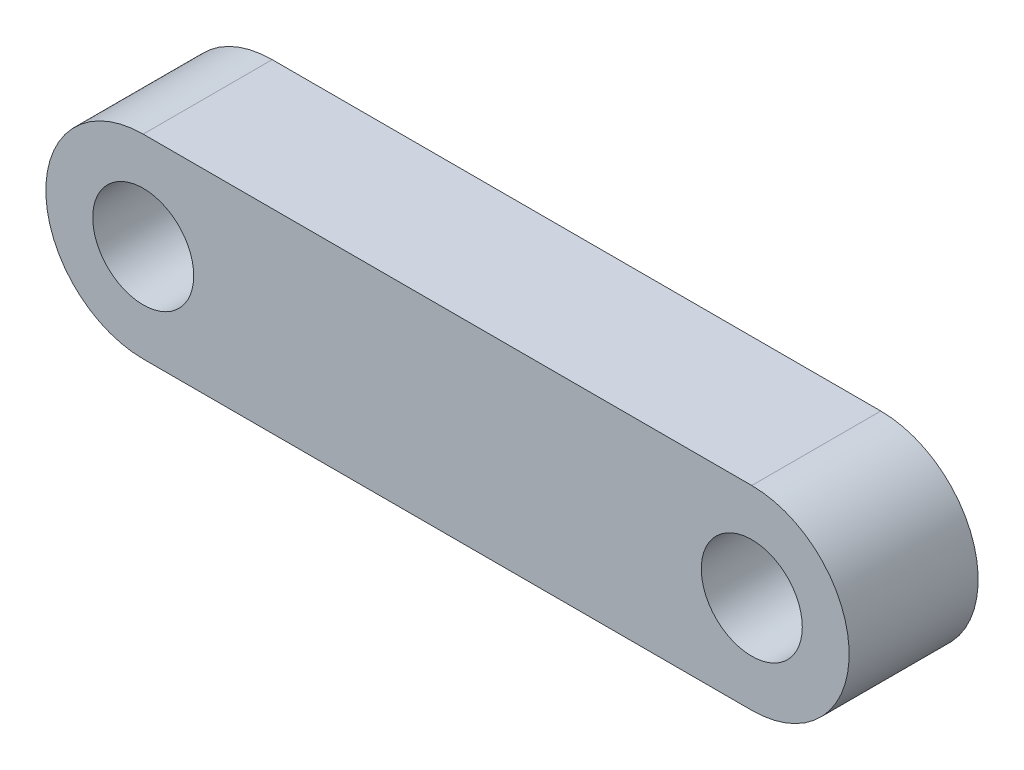
ISO-10303-21;
HEADER;
FILE_DESCRIPTION(('STEP AP214'),'2;1');
FILE_NAME('part.step','',(''),(''),'','','');
FILE_SCHEMA(('AUTOMOTIVE_DESIGN { 1 0 10303 214 1 1 1 1 }'));
ENDSEC;
DATA;
#1=APPLICATION_CONTEXT('core data for automotive mechanical design processes');
#2=APPLICATION_PROTOCOL_DEFINITION('international standard','automotive_design',2000,#1);
#3=PRODUCT_CONTEXT('',#1,'mechanical');
#4=PRODUCT('Part','Part','',(#3));
#5=PRODUCT_RELATED_PRODUCT_CATEGORY('part','',(#4));
#6=PRODUCT_DEFINITION_FORMATION('','',#4);
#7=PRODUCT_DEFINITION_CONTEXT('part definition',#1,'design');
#8=PRODUCT_DEFINITION('design','',#6,#7);
#9=PRODUCT_DEFINITION_SHAPE('','',#8);
#10=(LENGTH_UNIT() NAMED_UNIT(*) SI_UNIT(.MILLI.,.METRE.));
#11=(NAMED_UNIT(*) PLANE_ANGLE_UNIT() SI_UNIT($,.RADIAN.));
#12=(NAMED_UNIT(*) SI_UNIT($,.STERADIAN.) SOLID_ANGLE_UNIT());
#13=UNCERTAINTY_MEASURE_WITH_UNIT(LENGTH_MEASURE(1.E-05),#10,'distance_accuracy_value','');
#14=(GEOMETRIC_REPRESENTATION_CONTEXT(3) GLOBAL_UNCERTAINTY_ASSIGNED_CONTEXT((#13)) GLOBAL_UNIT_ASSIGNED_CONTEXT((#10,
#11,#12)) REPRESENTATION_CONTEXT('',''));
#15=CARTESIAN_POINT('',(0.,0.,0.));
#16=DIRECTION('',(0.,0.,1.));
#17=DIRECTION('',(1.,0.,0.));
#18=AXIS2_PLACEMENT_3D('',#15,#16,#17);
#19=CARTESIAN_POINT('',(25.,-28.3,-10.6));
#20=DIRECTION('',(0.,0.,1.));
#21=DIRECTION('',(1.,0.,0.));
#22=AXIS2_PLACEMENT_3D('',#19,#20,#21);
#23=CYLINDRICAL_SURFACE('',#22,8.);
#24=CARTESIAN_POINT('',(25.,-28.3,0.));
#25=DIRECTION('',(0.,0.,1.));
#26=DIRECTION('',(1.,0.,0.));
#27=AXIS2_PLACEMENT_3D('',#24,#25,#26);
#28=CIRCLE('',#27,8.);
#29=CARTESIAN_POINT('',(25.,-20.3,0.));
#30=VERTEX_POINT('',#29);
#31=CARTESIAN_POINT('',(25.,-36.3,0.));
#32=VERTEX_POINT('',#31);
#33=EDGE_CURVE('E106',#30,#32,#28,.F.);
#34=ORIENTED_EDGE('',*,*,#33,.T.);
#35=DIRECTION('',(0.,0.,1.));
#36=VECTOR('',#35,1.);
#37=CARTESIAN_POINT('',(25.,-36.3,-10.6));
#38=LINE('',#37,#36);
#39=CARTESIAN_POINT('',(25.,-36.3,-10.6));
#40=VERTEX_POINT('',#39);
#41=EDGE_CURVE('E11',#40,#32,#38,.T.);
#42=ORIENTED_EDGE('',*,*,#41,.F.);
#43=CARTESIAN_POINT('',(25.,-28.3,-10.6));
#44=DIRECTION('',(0.,0.,1.));
#45=DIRECTION('',(1.,0.,0.));
#46=AXIS2_PLACEMENT_3D('',#43,#44,#45);
#47=CIRCLE('',#46,8.);
#48=CARTESIAN_POINT('',(25.,-20.3,-10.6));
#49=VERTEX_POINT('',#48);
#50=EDGE_CURVE('E92',#49,#40,#47,.F.);
#51=ORIENTED_EDGE('',*,*,#50,.F.);
#52=DIRECTION('',(0.,0.,1.));
#53=VECTOR('',#52,1.);
#54=CARTESIAN_POINT('',(25.,-20.3,-10.6));
#55=LINE('',#54,#53);
#56=EDGE_CURVE('E38',#49,#30,#55,.T.);
#57=ORIENTED_EDGE('',*,*,#56,.T.);
#58=EDGE_LOOP('',(#34,#42,#51,#57));
#59=FACE_BOUND('',#58,.T.);
#60=ADVANCED_FACE('F35',(#59),#23,.T.);
#61=CARTESIAN_POINT('',(0.,-36.3,-10.6));
#62=DIRECTION('',(0.,1.,0.));
#63=DIRECTION('',(-1.,0.,0.));
#64=AXIS2_PLACEMENT_3D('',#61,#62,#63);
#65=PLANE('',#64);
#66=DIRECTION('',(-1.,0.,0.));
#67=VECTOR('',#66,1.);
#68=CARTESIAN_POINT('',(0.,-36.3,0.));
#69=LINE('',#68,#67);
#70=CARTESIAN_POINT('',(-25.,-36.3,0.));
#71=VERTEX_POINT('',#70);
#72=EDGE_CURVE('E74',#32,#71,#69,.T.);
#73=ORIENTED_EDGE('',*,*,#72,.T.);
#74=DIRECTION('',(0.,0.,1.));
#75=VECTOR('',#74,1.);
#76=CARTESIAN_POINT('',(-25.,-36.3,-10.6));
#77=LINE('',#76,#75);
#78=CARTESIAN_POINT('',(-25.,-36.3,-10.6));
#79=VERTEX_POINT('',#78);
#80=EDGE_CURVE('E44',#79,#71,#77,.T.);
#81=ORIENTED_EDGE('',*,*,#80,.F.);
#82=DIRECTION('',(-1.,0.,0.));
#83=VECTOR('',#82,1.);
#84=CARTESIAN_POINT('',(0.,-36.3,-10.6));
#85=LINE('',#84,#83);
#86=EDGE_CURVE('E52',#40,#79,#85,.T.);
#87=ORIENTED_EDGE('',*,*,#86,.F.);
#88=ORIENTED_EDGE('',*,*,#41,.T.);
#89=EDGE_LOOP('',(#73,#81,#87,#88));
#90=FACE_BOUND('',#89,.T.);
#91=ADVANCED_FACE('F123',(#90),#65,.F.);
#92=CARTESIAN_POINT('',(-25.,-28.3,-10.6));
#93=DIRECTION('',(0.,0.,1.));
#94=DIRECTION('',(1.,0.,0.));
#95=AXIS2_PLACEMENT_3D('',#92,#93,#94);
#96=CYLINDRICAL_SURFACE('',#95,8.);
#97=CARTESIAN_POINT('',(-25.,-28.3,0.));
#98=DIRECTION('',(0.,0.,1.));
#99=DIRECTION('',(1.,0.,0.));
#100=AXIS2_PLACEMENT_3D('',#97,#98,#99);
#101=CIRCLE('',#100,8.);
#102=CARTESIAN_POINT('',(-25.,-20.3,0.));
#103=VERTEX_POINT('',#102);
#104=EDGE_CURVE('E86',#103,#71,#101,.T.);
#105=ORIENTED_EDGE('',*,*,#104,.F.);
#106=DIRECTION('',(0.,0.,1.));
#107=VECTOR('',#106,1.);
#108=CARTESIAN_POINT('',(-25.,-20.3,-10.6));
#109=LINE('',#108,#107);
#110=CARTESIAN_POINT('',(-25.,-20.3,-10.6));
#111=VERTEX_POINT('',#110);
#112=EDGE_CURVE('E83',#111,#103,#109,.T.);
#113=ORIENTED_EDGE('',*,*,#112,.F.);
#114=CARTESIAN_POINT('',(-25.,-28.3,-10.6));
#115=DIRECTION('',(0.,0.,1.));
#116=DIRECTION('',(1.,0.,0.));
#117=AXIS2_PLACEMENT_3D('',#114,#115,#116);
#118=CIRCLE('',#117,8.);
#119=EDGE_CURVE('E85',#111,#79,#118,.T.);
#120=ORIENTED_EDGE('',*,*,#119,.T.);
#121=ORIENTED_EDGE('',*,*,#80,.T.);
#122=EDGE_LOOP('',(#105,#113,#120,#121));
#123=FACE_BOUND('',#122,.T.);
#124=ADVANCED_FACE('F84',(#123),#96,.T.);
#125=CARTESIAN_POINT('',(-25.,-28.3,-10.6));
#126=DIRECTION('',(0.,0.,1.));
#127=DIRECTION('',(1.,0.,0.));
#128=AXIS2_PLACEMENT_3D('',#125,#126,#127);
#129=CYLINDRICAL_SURFACE('',#128,4.15);
#130=CARTESIAN_POINT('',(-25.,-28.3,-10.6));
#131=DIRECTION('',(0.,0.,1.));
#132=DIRECTION('',(1.,0.,0.));
#133=AXIS2_PLACEMENT_3D('',#130,#131,#132);
#134=CIRCLE('',#133,4.15);
#135=CARTESIAN_POINT('',(-20.85,-28.3,-10.6));
#136=VERTEX_POINT('',#135);
#137=EDGE_CURVE('E97',#136,#136,#134,.T.);
#138=ORIENTED_EDGE('',*,*,#137,.F.);
#139=EDGE_LOOP('',(#138));
#140=FACE_BOUND('',#139,.T.);
#141=CARTESIAN_POINT('',(-25.,-28.3,0.));
#142=DIRECTION('',(0.,0.,1.));
#143=DIRECTION('',(1.,0.,0.));
#144=AXIS2_PLACEMENT_3D('',#141,#142,#143);
#145=CIRCLE('',#144,4.15);
#146=CARTESIAN_POINT('',(-20.85,-28.3,0.));
#147=VERTEX_POINT('',#146);
#148=EDGE_CURVE('E113',#147,#147,#145,.T.);
#149=ORIENTED_EDGE('',*,*,#148,.T.);
#150=EDGE_LOOP('',(#149));
#151=FACE_BOUND('',#150,.T.);
#152=ADVANCED_FACE('F130',(#140,#151),#129,.F.);
#153=CARTESIAN_POINT('',(0.,-20.3,-10.6));
#154=DIRECTION('',(0.,-1.,0.));
#155=DIRECTION('',(1.,0.,0.));
#156=AXIS2_PLACEMENT_3D('',#153,#154,#155);
#157=PLANE('',#156);
#158=DIRECTION('',(1.,0.,0.));
#159=VECTOR('',#158,1.);
#160=CARTESIAN_POINT('',(0.,-20.3,0.));
#161=LINE('',#160,#159);
#162=EDGE_CURVE('E109',#103,#30,#161,.T.);
#163=ORIENTED_EDGE('',*,*,#162,.T.);
#164=ORIENTED_EDGE('',*,*,#56,.F.);
#165=DIRECTION('',(1.,0.,0.));
#166=VECTOR('',#165,1.);
#167=CARTESIAN_POINT('',(0.,-20.3,-10.6));
#168=LINE('',#167,#166);
#169=EDGE_CURVE('E80',#111,#49,#168,.T.);
#170=ORIENTED_EDGE('',*,*,#169,.F.);
#171=ORIENTED_EDGE('',*,*,#112,.T.);
#172=EDGE_LOOP('',(#163,#164,#170,#171));
#173=FACE_BOUND('',#172,.T.);
#174=ADVANCED_FACE('F89',(#173),#157,.F.);
#175=CARTESIAN_POINT('',(25.,-28.3,-10.6));
#176=DIRECTION('',(0.,0.,1.));
#177=DIRECTION('',(1.,0.,0.));
#178=AXIS2_PLACEMENT_3D('',#175,#176,#177);
#179=CYLINDRICAL_SURFACE('',#178,4.15);
#180=CARTESIAN_POINT('',(25.,-28.3,-10.6));
#181=DIRECTION('',(0.,0.,1.));
#182=DIRECTION('',(1.,0.,0.));
#183=AXIS2_PLACEMENT_3D('',#180,#181,#182);
#184=CIRCLE('',#183,4.15);
#185=CARTESIAN_POINT('',(29.15,-28.3,-10.6));
#186=VERTEX_POINT('',#185);
#187=EDGE_CURVE('E103',#186,#186,#184,.F.);
#188=ORIENTED_EDGE('',*,*,#187,.T.);
#189=EDGE_LOOP('',(#188));
#190=FACE_BOUND('',#189,.T.);
#191=CARTESIAN_POINT('',(25.,-28.3,0.));
#192=DIRECTION('',(0.,0.,1.));
#193=DIRECTION('',(1.,0.,0.));
#194=AXIS2_PLACEMENT_3D('',#191,#192,#193);
#195=CIRCLE('',#194,4.15);
#196=CARTESIAN_POINT('',(29.15,-28.3,0.));
#197=VERTEX_POINT('',#196);
#198=EDGE_CURVE('E116',#197,#197,#195,.F.);
#199=ORIENTED_EDGE('',*,*,#198,.F.);
#200=EDGE_LOOP('',(#199));
#201=FACE_BOUND('',#200,.T.);
#202=ADVANCED_FACE('F138',(#190,#201),#179,.F.);
#203=CARTESIAN_POINT('',(0.,0.,-10.6));
#204=DIRECTION('',(0.,0.,1.));
#205=DIRECTION('',(1.,0.,0.));
#206=AXIS2_PLACEMENT_3D('',#203,#204,#205);
#207=PLANE('',#206);
#208=ORIENTED_EDGE('',*,*,#50,.T.);
#209=ORIENTED_EDGE('',*,*,#86,.T.);
#210=ORIENTED_EDGE('',*,*,#119,.F.);
#211=ORIENTED_EDGE('',*,*,#169,.T.);
#212=EDGE_LOOP('',(#208,#209,#210,#211));
#213=FACE_BOUND('',#212,.T.);
#214=ORIENTED_EDGE('',*,*,#137,.T.);
#215=EDGE_LOOP('',(#214));
#216=FACE_BOUND('',#215,.T.);
#217=ORIENTED_EDGE('',*,*,#187,.F.);
#218=EDGE_LOOP('',(#217));
#219=FACE_BOUND('',#218,.T.);
#220=ADVANCED_FACE('F94',(#213,#216,#219),#207,.F.);
#221=CARTESIAN_POINT('',(0.,0.,0.));
#222=DIRECTION('',(0.,0.,1.));
#223=DIRECTION('',(1.,0.,0.));
#224=AXIS2_PLACEMENT_3D('',#221,#222,#223);
#225=PLANE('',#224);
#226=ORIENTED_EDGE('',*,*,#33,.F.);
#227=ORIENTED_EDGE('',*,*,#162,.F.);
#228=ORIENTED_EDGE('',*,*,#104,.T.);
#229=ORIENTED_EDGE('',*,*,#72,.F.);
#230=EDGE_LOOP('',(#226,#227,#228,#229));
#231=FACE_BOUND('',#230,.T.);
#232=ORIENTED_EDGE('',*,*,#148,.F.);
#233=EDGE_LOOP('',(#232));
#234=FACE_BOUND('',#233,.T.);
#235=ORIENTED_EDGE('',*,*,#198,.T.);
#236=EDGE_LOOP('',(#235));
#237=FACE_BOUND('',#236,.T.);
#238=ADVANCED_FACE('F124',(#231,#234,#237),#225,.T.);
#239=CLOSED_SHELL('',(#60,#91,#124,#152,#174,#202,#220,#238));
#240=MANIFOLD_SOLID_BREP('B2',#239);
#241=ADVANCED_BREP_SHAPE_REPRESENTATION('',(#18,#240),#14);
#242=SHAPE_DEFINITION_REPRESENTATION(#9,#241);
ENDSEC;
END-ISO-10303-21;
